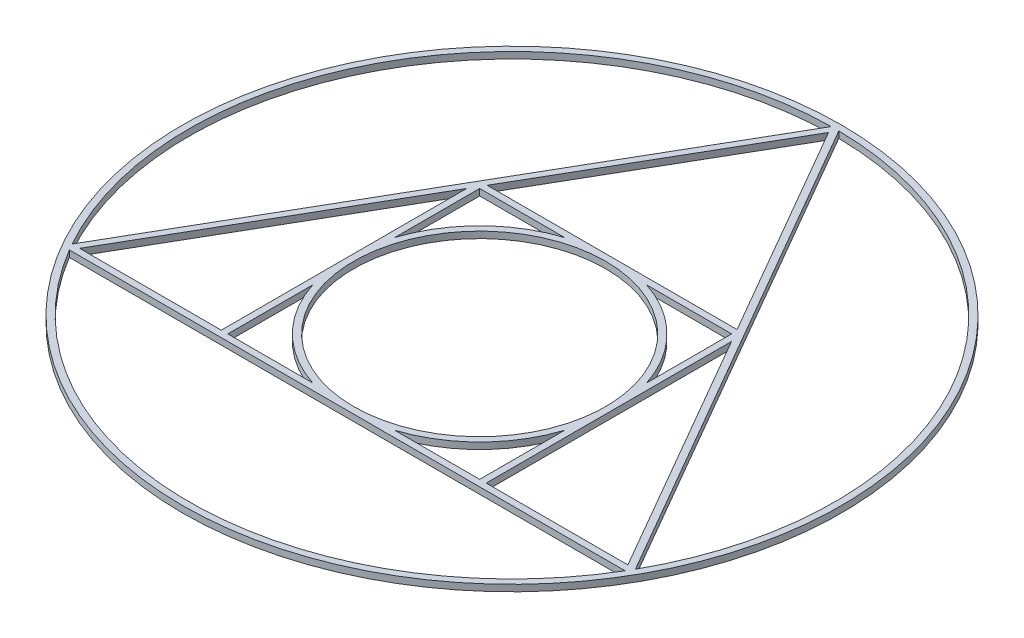
ISO-10303-21;
HEADER;
FILE_DESCRIPTION(('STEP AP214'),'2;1');
FILE_NAME('part.step','',(''),(''),'','','');
FILE_SCHEMA(('AUTOMOTIVE_DESIGN { 1 0 10303 214 1 1 1 1 }'));
ENDSEC;
DATA;
#1=APPLICATION_CONTEXT('core data for automotive mechanical design processes');
#2=APPLICATION_PROTOCOL_DEFINITION('international standard','automotive_design',2000,#1);
#3=PRODUCT_CONTEXT('',#1,'mechanical');
#4=PRODUCT('Part','Part','',(#3));
#5=PRODUCT_RELATED_PRODUCT_CATEGORY('part','',(#4));
#6=PRODUCT_DEFINITION_FORMATION('','',#4);
#7=PRODUCT_DEFINITION_CONTEXT('part definition',#1,'design');
#8=PRODUCT_DEFINITION('design','',#6,#7);
#9=PRODUCT_DEFINITION_SHAPE('','',#8);
#10=(LENGTH_UNIT() NAMED_UNIT(*) SI_UNIT(.MILLI.,.METRE.));
#11=(NAMED_UNIT(*) PLANE_ANGLE_UNIT() SI_UNIT($,.RADIAN.));
#12=(NAMED_UNIT(*) SI_UNIT($,.STERADIAN.) SOLID_ANGLE_UNIT());
#13=UNCERTAINTY_MEASURE_WITH_UNIT(LENGTH_MEASURE(1.E-05),#10,'distance_accuracy_value','');
#14=(GEOMETRIC_REPRESENTATION_CONTEXT(3) GLOBAL_UNCERTAINTY_ASSIGNED_CONTEXT((#13)) GLOBAL_UNIT_ASSIGNED_CONTEXT((#10,
#11,#12)) REPRESENTATION_CONTEXT('',''));
#15=CARTESIAN_POINT('',(0.,0.,0.));
#16=DIRECTION('',(0.,0.,1.));
#17=DIRECTION('',(1.,0.,0.));
#18=AXIS2_PLACEMENT_3D('',#15,#16,#17);
#19=CARTESIAN_POINT('',(-69.8234858046924,3.61,0.));
#20=DIRECTION('',(-1.,0.,0.));
#21=DIRECTION('',(0.,0.,1.));
#22=AXIS2_PLACEMENT_3D('',#19,#20,#21);
#23=PLANE('',#22);
#24=DIRECTION('',(0.,0.,-1.));
#25=VECTOR('',#24,1.);
#26=CARTESIAN_POINT('',(-69.8234858046924,0.,0.));
#27=LINE('',#26,#25);
#28=CARTESIAN_POINT('',(-69.8234858046924,0.,87.7425));
#29=VERTEX_POINT('',#28);
#30=CARTESIAN_POINT('',(-69.8234858046924,0.,40.6601150373927));
#31=VERTEX_POINT('',#30);
#32=EDGE_CURVE('E239',#29,#31,#27,.T.);
#33=ORIENTED_EDGE('',*,*,#32,.T.);
#34=DIRECTION('',(0.,-1.,0.));
#35=VECTOR('',#34,1.);
#36=CARTESIAN_POINT('',(-69.8234858046924,3.61,40.6601150373927));
#37=LINE('',#36,#35);
#38=CARTESIAN_POINT('',(-69.8234858046924,3.61,40.6601150373927));
#39=VERTEX_POINT('',#38);
#40=EDGE_CURVE('E11',#39,#31,#37,.T.);
#41=ORIENTED_EDGE('',*,*,#40,.F.);
#42=DIRECTION('',(0.,0.,-1.));
#43=VECTOR('',#42,1.);
#44=CARTESIAN_POINT('',(-69.8234858046924,3.61,0.));
#45=LINE('',#44,#43);
#46=CARTESIAN_POINT('',(-69.8234858046924,3.61,87.7425));
#47=VERTEX_POINT('',#46);
#48=EDGE_CURVE('E233',#47,#39,#45,.T.);
#49=ORIENTED_EDGE('',*,*,#48,.F.);
#50=DIRECTION('',(0.,-1.,0.));
#51=VECTOR('',#50,1.);
#52=CARTESIAN_POINT('',(-69.8234858046924,3.61,87.7425));
#53=LINE('',#52,#51);
#54=EDGE_CURVE('E59',#47,#29,#53,.T.);
#55=ORIENTED_EDGE('',*,*,#54,.T.);
#56=EDGE_LOOP('',(#33,#41,#49,#55));
#57=FACE_BOUND('',#56,.T.);
#58=ADVANCED_FACE('F39',(#57),#23,.F.);
#59=CARTESIAN_POINT('',(0.,3.61,17.9190141953076));
#60=DIRECTION('',(0.,-1.,0.));
#61=DIRECTION('',(0.,0.,-1.));
#62=AXIS2_PLACEMENT_3D('',#59,#60,#61);
#63=CYLINDRICAL_SURFACE('',#62,73.4334858046924);
#64=CARTESIAN_POINT('',(0.,0.,17.9190141953076));
#65=DIRECTION('',(0.,1.,0.));
#66=DIRECTION('',(0.,0.,1.));
#67=AXIS2_PLACEMENT_3D('',#64,#65,#66);
#68=CIRCLE('',#67,73.4334858046924);
#69=CARTESIAN_POINT('',(-22.7411008420851,0.,87.7425));
#70=VERTEX_POINT('',#69);
#71=EDGE_CURVE('E243',#31,#70,#68,.T.);
#72=ORIENTED_EDGE('',*,*,#71,.T.);
#73=DIRECTION('',(0.,-1.,0.));
#74=VECTOR('',#73,1.);
#75=CARTESIAN_POINT('',(-22.7411008420851,3.61,87.7425));
#76=LINE('',#75,#74);
#77=CARTESIAN_POINT('',(-22.7411008420851,3.61,87.7425));
#78=VERTEX_POINT('',#77);
#79=EDGE_CURVE('E50',#78,#70,#76,.T.);
#80=ORIENTED_EDGE('',*,*,#79,.F.);
#81=CARTESIAN_POINT('',(0.,3.61,17.9190141953076));
#82=DIRECTION('',(0.,1.,0.));
#83=DIRECTION('',(0.,0.,1.));
#84=AXIS2_PLACEMENT_3D('',#81,#82,#83);
#85=CIRCLE('',#84,73.4334858046924);
#86=EDGE_CURVE('E225',#39,#78,#85,.T.);
#87=ORIENTED_EDGE('',*,*,#86,.F.);
#88=ORIENTED_EDGE('',*,*,#40,.T.);
#89=EDGE_LOOP('',(#72,#80,#87,#88));
#90=FACE_BOUND('',#89,.T.);
#91=ADVANCED_FACE('F227',(#90),#63,.T.);
#92=CARTESIAN_POINT('',(0.,3.61,-51.9044716093848));
#93=DIRECTION('',(0.,0.,1.));
#94=DIRECTION('',(1.,0.,0.));
#95=AXIS2_PLACEMENT_3D('',#92,#93,#94);
#96=PLANE('',#95);
#97=DIRECTION('',(-1.,0.,0.));
#98=VECTOR('',#97,1.);
#99=CARTESIAN_POINT('',(0.,0.,-51.9044716093848));
#100=LINE('',#99,#98);
#101=CARTESIAN_POINT('',(-22.7411008420851,0.,-51.9044716093848));
#102=VERTEX_POINT('',#101);
#103=CARTESIAN_POINT('',(-69.8234858046924,0.,-51.9044716093848));
#104=VERTEX_POINT('',#103);
#105=EDGE_CURVE('E428',#102,#104,#100,.T.);
#106=ORIENTED_EDGE('',*,*,#105,.F.);
#107=DIRECTION('',(0.,-1.,0.));
#108=VECTOR('',#107,1.);
#109=CARTESIAN_POINT('',(-22.7411008420851,3.61,-51.9044716093848));
#110=LINE('',#109,#108);
#111=CARTESIAN_POINT('',(-22.7411008420851,3.61,-51.9044716093848));
#112=VERTEX_POINT('',#111);
#113=EDGE_CURVE('E260',#112,#102,#110,.T.);
#114=ORIENTED_EDGE('',*,*,#113,.F.);
#115=DIRECTION('',(-1.,0.,0.));
#116=VECTOR('',#115,1.);
#117=CARTESIAN_POINT('',(0.,3.61,-51.9044716093848));
#118=LINE('',#117,#116);
#119=CARTESIAN_POINT('',(-69.8234858046924,3.61,-51.9044716093848));
#120=VERTEX_POINT('',#119);
#121=EDGE_CURVE('E446',#112,#120,#118,.T.);
#122=ORIENTED_EDGE('',*,*,#121,.T.);
#123=DIRECTION('',(0.,-1.,0.));
#124=VECTOR('',#123,1.);
#125=CARTESIAN_POINT('',(-69.8234858046924,3.61,-51.9044716093848));
#126=LINE('',#125,#124);
#127=EDGE_CURVE('E263',#120,#104,#126,.T.);
#128=ORIENTED_EDGE('',*,*,#127,.T.);
#129=EDGE_LOOP('',(#106,#114,#122,#128));
#130=FACE_BOUND('',#129,.T.);
#131=ADVANCED_FACE('F442',(#130),#96,.T.);
#132=CARTESIAN_POINT('',(0.,3.61,17.9190141953076));
#133=DIRECTION('',(0.,-1.,0.));
#134=DIRECTION('',(0.,0.,-1.));
#135=AXIS2_PLACEMENT_3D('',#132,#133,#134);
#136=CYLINDRICAL_SURFACE('',#135,73.4334858046924);
#137=CARTESIAN_POINT('',(0.,0.,17.9190141953076));
#138=DIRECTION('',(0.,1.,0.));
#139=DIRECTION('',(0.,0.,1.));
#140=AXIS2_PLACEMENT_3D('',#137,#138,#139);
#141=CIRCLE('',#140,73.4334858046924);
#142=CARTESIAN_POINT('',(-69.8234858046924,0.,-4.82208664677747));
#143=VERTEX_POINT('',#142);
#144=EDGE_CURVE('E251',#102,#143,#141,.T.);
#145=ORIENTED_EDGE('',*,*,#144,.T.);
#146=DIRECTION('',(0.,-1.,0.));
#147=VECTOR('',#146,1.);
#148=CARTESIAN_POINT('',(-69.8234858046924,3.61,-4.82208664677747));
#149=LINE('',#148,#147);
#150=CARTESIAN_POINT('',(-69.8234858046924,3.61,-4.82208664677747));
#151=VERTEX_POINT('',#150);
#152=EDGE_CURVE('E266',#151,#143,#149,.T.);
#153=ORIENTED_EDGE('',*,*,#152,.F.);
#154=CARTESIAN_POINT('',(0.,3.61,17.9190141953076));
#155=DIRECTION('',(0.,1.,0.));
#156=DIRECTION('',(0.,0.,1.));
#157=AXIS2_PLACEMENT_3D('',#154,#155,#156);
#158=CIRCLE('',#157,73.4334858046924);
#159=EDGE_CURVE('E452',#112,#151,#158,.T.);
#160=ORIENTED_EDGE('',*,*,#159,.F.);
#161=ORIENTED_EDGE('',*,*,#113,.T.);
#162=EDGE_LOOP('',(#145,#153,#160,#161));
#163=FACE_BOUND('',#162,.T.);
#164=ADVANCED_FACE('F436',(#163),#136,.T.);
#165=CARTESIAN_POINT('',(69.8234858046924,3.61,0.));
#166=DIRECTION('',(-1.,0.,0.));
#167=DIRECTION('',(0.,0.,1.));
#168=AXIS2_PLACEMENT_3D('',#165,#166,#167);
#169=PLANE('',#168);
#170=DIRECTION('',(0.,0.,-1.));
#171=VECTOR('',#170,1.);
#172=CARTESIAN_POINT('',(69.8234858046924,0.,0.));
#173=LINE('',#172,#171);
#174=CARTESIAN_POINT('',(69.8234858046924,0.,-4.82208664677747));
#175=VERTEX_POINT('',#174);
#176=CARTESIAN_POINT('',(69.8234858046924,0.,-51.9044716093848));
#177=VERTEX_POINT('',#176);
#178=EDGE_CURVE('E416',#175,#177,#173,.T.);
#179=ORIENTED_EDGE('',*,*,#178,.F.);
#180=DIRECTION('',(0.,-1.,0.));
#181=VECTOR('',#180,1.);
#182=CARTESIAN_POINT('',(69.8234858046924,3.61,-4.82208664677747));
#183=LINE('',#182,#181);
#184=CARTESIAN_POINT('',(69.8234858046924,3.61,-4.82208664677747));
#185=VERTEX_POINT('',#184);
#186=EDGE_CURVE('E267',#185,#175,#183,.T.);
#187=ORIENTED_EDGE('',*,*,#186,.F.);
#188=DIRECTION('',(0.,0.,-1.));
#189=VECTOR('',#188,1.);
#190=CARTESIAN_POINT('',(69.8234858046924,3.61,0.));
#191=LINE('',#190,#189);
#192=CARTESIAN_POINT('',(69.8234858046924,3.61,-51.9044716093848));
#193=VERTEX_POINT('',#192);
#194=EDGE_CURVE('E466',#185,#193,#191,.T.);
#195=ORIENTED_EDGE('',*,*,#194,.T.);
#196=DIRECTION('',(0.,-1.,0.));
#197=VECTOR('',#196,1.);
#198=CARTESIAN_POINT('',(69.8234858046924,3.61,-51.9044716093848));
#199=LINE('',#198,#197);
#200=EDGE_CURVE('E273',#193,#177,#199,.T.);
#201=ORIENTED_EDGE('',*,*,#200,.T.);
#202=EDGE_LOOP('',(#179,#187,#195,#201));
#203=FACE_BOUND('',#202,.T.);
#204=ADVANCED_FACE('F587',(#203),#169,.T.);
#205=CARTESIAN_POINT('',(0.,3.61,17.9190141953076));
#206=DIRECTION('',(0.,-1.,0.));
#207=DIRECTION('',(0.,0.,-1.));
#208=AXIS2_PLACEMENT_3D('',#205,#206,#207);
#209=CYLINDRICAL_SURFACE('',#208,73.4334858046924);
#210=CARTESIAN_POINT('',(0.,0.,17.9190141953076));
#211=DIRECTION('',(0.,1.,0.));
#212=DIRECTION('',(0.,0.,1.));
#213=AXIS2_PLACEMENT_3D('',#210,#211,#212);
#214=CIRCLE('',#213,73.4334858046924);
#215=CARTESIAN_POINT('',(22.7411008420851,0.,-51.9044716093848));
#216=VERTEX_POINT('',#215);
#217=EDGE_CURVE('E420',#175,#216,#214,.T.);
#218=ORIENTED_EDGE('',*,*,#217,.T.);
#219=DIRECTION('',(0.,-1.,0.));
#220=VECTOR('',#219,1.);
#221=CARTESIAN_POINT('',(22.7411008420851,3.61,-51.9044716093848));
#222=LINE('',#221,#220);
#223=CARTESIAN_POINT('',(22.7411008420851,3.61,-51.9044716093848));
#224=VERTEX_POINT('',#223);
#225=EDGE_CURVE('E276',#224,#216,#222,.T.);
#226=ORIENTED_EDGE('',*,*,#225,.F.);
#227=CARTESIAN_POINT('',(0.,3.61,17.9190141953076));
#228=DIRECTION('',(0.,1.,0.));
#229=DIRECTION('',(0.,0.,1.));
#230=AXIS2_PLACEMENT_3D('',#227,#228,#229);
#231=CIRCLE('',#230,73.4334858046924);
#232=EDGE_CURVE('E463',#185,#224,#231,.T.);
#233=ORIENTED_EDGE('',*,*,#232,.F.);
#234=ORIENTED_EDGE('',*,*,#186,.T.);
#235=EDGE_LOOP('',(#218,#226,#233,#234));
#236=FACE_BOUND('',#235,.T.);
#237=ADVANCED_FACE('F585',(#236),#209,.T.);
#238=CARTESIAN_POINT('',(0.,3.61,87.7425));
#239=DIRECTION('',(0.,0.,1.));
#240=DIRECTION('',(1.,0.,0.));
#241=AXIS2_PLACEMENT_3D('',#238,#239,#240);
#242=PLANE('',#241);
#243=DIRECTION('',(-1.,0.,0.));
#244=VECTOR('',#243,1.);
#245=CARTESIAN_POINT('',(0.,0.,87.7425));
#246=LINE('',#245,#244);
#247=CARTESIAN_POINT('',(69.8234858046924,0.,87.7425));
#248=VERTEX_POINT('',#247);
#249=CARTESIAN_POINT('',(22.7411008420852,0.,87.7425));
#250=VERTEX_POINT('',#249);
#251=EDGE_CURVE('E404',#248,#250,#246,.T.);
#252=ORIENTED_EDGE('',*,*,#251,.T.);
#253=DIRECTION('',(0.,-1.,0.));
#254=VECTOR('',#253,1.);
#255=CARTESIAN_POINT('',(22.7411008420852,3.61,87.7425));
#256=LINE('',#255,#254);
#257=CARTESIAN_POINT('',(22.7411008420852,3.61,87.7425));
#258=VERTEX_POINT('',#257);
#259=EDGE_CURVE('E277',#258,#250,#256,.T.);
#260=ORIENTED_EDGE('',*,*,#259,.F.);
#261=DIRECTION('',(-1.,0.,0.));
#262=VECTOR('',#261,1.);
#263=CARTESIAN_POINT('',(0.,3.61,87.7425));
#264=LINE('',#263,#262);
#265=CARTESIAN_POINT('',(69.8234858046924,3.61,87.7425));
#266=VERTEX_POINT('',#265);
#267=EDGE_CURVE('E477',#266,#258,#264,.T.);
#268=ORIENTED_EDGE('',*,*,#267,.F.);
#269=DIRECTION('',(0.,-1.,0.));
#270=VECTOR('',#269,1.);
#271=CARTESIAN_POINT('',(69.8234858046924,3.61,87.7425));
#272=LINE('',#271,#270);
#273=EDGE_CURVE('E282',#266,#248,#272,.T.);
#274=ORIENTED_EDGE('',*,*,#273,.T.);
#275=EDGE_LOOP('',(#252,#260,#268,#274));
#276=FACE_BOUND('',#275,.T.);
#277=ADVANCED_FACE('F614',(#276),#242,.F.);
#278=CARTESIAN_POINT('',(0.,3.61,17.9190141953076));
#279=DIRECTION('',(0.,-1.,0.));
#280=DIRECTION('',(0.,0.,-1.));
#281=AXIS2_PLACEMENT_3D('',#278,#279,#280);
#282=CYLINDRICAL_SURFACE('',#281,73.4334858046924);
#283=CARTESIAN_POINT('',(0.,0.,17.9190141953076));
#284=DIRECTION('',(0.,1.,0.));
#285=DIRECTION('',(0.,0.,1.));
#286=AXIS2_PLACEMENT_3D('',#283,#284,#285);
#287=CIRCLE('',#286,73.4334858046924);
#288=CARTESIAN_POINT('',(69.8234858046924,0.,40.6601150373927));
#289=VERTEX_POINT('',#288);
#290=EDGE_CURVE('E408',#250,#289,#287,.T.);
#291=ORIENTED_EDGE('',*,*,#290,.T.);
#292=DIRECTION('',(0.,-1.,0.));
#293=VECTOR('',#292,1.);
#294=CARTESIAN_POINT('',(69.8234858046924,3.61,40.6601150373927));
#295=LINE('',#294,#293);
#296=CARTESIAN_POINT('',(69.8234858046924,3.61,40.6601150373927));
#297=VERTEX_POINT('',#296);
#298=EDGE_CURVE('E285',#297,#289,#295,.T.);
#299=ORIENTED_EDGE('',*,*,#298,.F.);
#300=CARTESIAN_POINT('',(0.,3.61,17.9190141953076));
#301=DIRECTION('',(0.,1.,0.));
#302=DIRECTION('',(0.,0.,1.));
#303=AXIS2_PLACEMENT_3D('',#300,#301,#302);
#304=CIRCLE('',#303,73.4334858046924);
#305=EDGE_CURVE('E474',#258,#297,#304,.T.);
#306=ORIENTED_EDGE('',*,*,#305,.F.);
#307=ORIENTED_EDGE('',*,*,#259,.T.);
#308=EDGE_LOOP('',(#291,#299,#306,#307));
#309=FACE_BOUND('',#308,.T.);
#310=ADVANCED_FACE('F621',(#309),#282,.T.);
#311=CARTESIAN_POINT('',(0.,3.61,0.));
#312=DIRECTION('',(0.,-1.,0.));
#313=DIRECTION('',(0.,0.,-1.));
#314=AXIS2_PLACEMENT_3D('',#311,#312,#313);
#315=CYLINDRICAL_SURFACE('',#314,179.095);
#316=CARTESIAN_POINT('',(0.,0.,0.));
#317=DIRECTION('',(0.,1.,0.));
#318=DIRECTION('',(0.,0.,1.));
#319=AXIS2_PLACEMENT_3D('',#316,#317,#318);
#320=CIRCLE('',#319,179.095);
#321=CARTESIAN_POINT('',(-2.09128410943485,0.,-179.082789669397));
#322=VERTEX_POINT('',#321);
#323=CARTESIAN_POINT('',(-156.135887289001,0.,87.7302896693974));
#324=VERTEX_POINT('',#323);
#325=EDGE_CURVE('E392',#322,#324,#320,.T.);
#326=ORIENTED_EDGE('',*,*,#325,.F.);
#327=DIRECTION('',(0.,-1.,0.));
#328=VECTOR('',#327,1.);
#329=CARTESIAN_POINT('',(-2.09128410943485,3.61,-179.082789669397));
#330=LINE('',#329,#328);
#331=CARTESIAN_POINT('',(-2.09128410943485,3.61,-179.082789669397));
#332=VERTEX_POINT('',#331);
#333=EDGE_CURVE('E286',#332,#322,#330,.T.);
#334=ORIENTED_EDGE('',*,*,#333,.F.);
#335=CARTESIAN_POINT('',(0.,3.61,0.));
#336=DIRECTION('',(0.,1.,0.));
#337=DIRECTION('',(0.,0.,1.));
#338=AXIS2_PLACEMENT_3D('',#335,#336,#337);
#339=CIRCLE('',#338,179.095);
#340=CARTESIAN_POINT('',(-156.135887289001,3.61,87.7302896693974));
#341=VERTEX_POINT('',#340);
#342=EDGE_CURVE('E488',#332,#341,#339,.T.);
#343=ORIENTED_EDGE('',*,*,#342,.T.);
#344=DIRECTION('',(0.,-1.,0.));
#345=VECTOR('',#344,1.);
#346=CARTESIAN_POINT('',(-156.135887289001,3.61,87.7302896693974));
#347=LINE('',#346,#345);
#348=EDGE_CURVE('E292',#341,#324,#347,.T.);
#349=ORIENTED_EDGE('',*,*,#348,.T.);
#350=EDGE_LOOP('',(#326,#334,#343,#349));
#351=FACE_BOUND('',#350,.T.);
#352=ADVANCED_FACE('F624',(#351),#315,.F.);
#353=CARTESIAN_POINT('',(-75.9872339915561,3.61,-43.87125));
#354=DIRECTION('',(0.866025403784439,0.,0.5));
#355=DIRECTION('',(0.5,0.,-0.866025403784439));
#356=AXIS2_PLACEMENT_3D('',#353,#354,#355);
#357=PLANE('',#356);
#358=DIRECTION('',(-0.5,0.,0.866025403784439));
#359=VECTOR('',#358,1.);
#360=CARTESIAN_POINT('',(-75.9872339915561,0.,-43.87125));
#361=LINE('',#360,#359);
#362=CARTESIAN_POINT('',(-73.4334858046924,0.,-48.2944716093847));
#363=VERTEX_POINT('',#362);
#364=CARTESIAN_POINT('',(-151.974467983112,0.,87.7425000000001));
#365=VERTEX_POINT('',#364);
#366=EDGE_CURVE('E380',#363,#365,#361,.T.);
#367=ORIENTED_EDGE('',*,*,#366,.F.);
#368=DIRECTION('',(0.,-1.,0.));
#369=VECTOR('',#368,1.);
#370=CARTESIAN_POINT('',(-73.4334858046924,3.61,-48.2944716093847));
#371=LINE('',#370,#369);
#372=CARTESIAN_POINT('',(-73.4334858046924,3.61,-48.2944716093847));
#373=VERTEX_POINT('',#372);
#374=EDGE_CURVE('E295',#373,#363,#371,.T.);
#375=ORIENTED_EDGE('',*,*,#374,.F.);
#376=DIRECTION('',(-0.5,0.,0.866025403784439));
#377=VECTOR('',#376,1.);
#378=CARTESIAN_POINT('',(-75.9872339915561,3.61,-43.87125));
#379=LINE('',#378,#377);
#380=CARTESIAN_POINT('',(-151.974467983112,3.61,87.7425000000001));
#381=VERTEX_POINT('',#380);
#382=EDGE_CURVE('E500',#373,#381,#379,.T.);
#383=ORIENTED_EDGE('',*,*,#382,.T.);
#384=DIRECTION('',(0.,-1.,0.));
#385=VECTOR('',#384,1.);
#386=CARTESIAN_POINT('',(-151.974467983112,3.61,87.7425000000001));
#387=LINE('',#386,#385);
#388=EDGE_CURVE('E298',#381,#365,#387,.T.);
#389=ORIENTED_EDGE('',*,*,#388,.T.);
#390=EDGE_LOOP('',(#367,#375,#383,#389));
#391=FACE_BOUND('',#390,.T.);
#392=ADVANCED_FACE('F639',(#391),#357,.T.);
#393=CARTESIAN_POINT('',(-73.4334858046924,3.61,0.));
#394=DIRECTION('',(-1.,0.,0.));
#395=DIRECTION('',(0.,0.,1.));
#396=AXIS2_PLACEMENT_3D('',#393,#394,#395);
#397=PLANE('',#396);
#398=DIRECTION('',(0.,0.,-1.));
#399=VECTOR('',#398,1.);
#400=CARTESIAN_POINT('',(-73.4334858046924,0.,0.));
#401=LINE('',#400,#399);
#402=CARTESIAN_POINT('',(-73.4334858046924,0.,87.7425));
#403=VERTEX_POINT('',#402);
#404=EDGE_CURVE('E384',#403,#363,#401,.T.);
#405=ORIENTED_EDGE('',*,*,#404,.F.);
#406=DIRECTION('',(0.,-1.,0.));
#407=VECTOR('',#406,1.);
#408=CARTESIAN_POINT('',(-73.4334858046924,3.61,87.7425));
#409=LINE('',#408,#407);
#410=CARTESIAN_POINT('',(-73.4334858046924,3.61,87.7425));
#411=VERTEX_POINT('',#410);
#412=EDGE_CURVE('E301',#411,#403,#409,.T.);
#413=ORIENTED_EDGE('',*,*,#412,.F.);
#414=DIRECTION('',(0.,0.,-1.));
#415=VECTOR('',#414,1.);
#416=CARTESIAN_POINT('',(-73.4334858046924,3.61,0.));
#417=LINE('',#416,#415);
#418=EDGE_CURVE('E496',#411,#373,#417,.T.);
#419=ORIENTED_EDGE('',*,*,#418,.T.);
#420=ORIENTED_EDGE('',*,*,#374,.T.);
#421=EDGE_LOOP('',(#405,#413,#419,#420));
#422=FACE_BOUND('',#421,.T.);
#423=ADVANCED_FACE('F645',(#422),#397,.T.);
#424=CARTESIAN_POINT('',(0.,3.61,87.7425));
#425=DIRECTION('',(0.,0.,-1.));
#426=DIRECTION('',(-1.,0.,0.));
#427=AXIS2_PLACEMENT_3D('',#424,#425,#426);
#428=PLANE('',#427);
#429=DIRECTION('',(1.,0.,0.));
#430=VECTOR('',#429,1.);
#431=CARTESIAN_POINT('',(0.,0.,87.7425));
#432=LINE('',#431,#430);
#433=CARTESIAN_POINT('',(73.4334858046924,0.,87.7425));
#434=VERTEX_POINT('',#433);
#435=CARTESIAN_POINT('',(151.974467983112,0.,87.7424999999999));
#436=VERTEX_POINT('',#435);
#437=EDGE_CURVE('E368',#434,#436,#432,.T.);
#438=ORIENTED_EDGE('',*,*,#437,.F.);
#439=DIRECTION('',(0.,-1.,0.));
#440=VECTOR('',#439,1.);
#441=CARTESIAN_POINT('',(73.4334858046924,3.61,87.7425));
#442=LINE('',#441,#440);
#443=CARTESIAN_POINT('',(73.4334858046924,3.61,87.7425));
#444=VERTEX_POINT('',#443);
#445=EDGE_CURVE('E302',#444,#434,#442,.T.);
#446=ORIENTED_EDGE('',*,*,#445,.F.);
#447=DIRECTION('',(1.,0.,0.));
#448=VECTOR('',#447,1.);
#449=CARTESIAN_POINT('',(0.,3.61,87.7425));
#450=LINE('',#449,#448);
#451=CARTESIAN_POINT('',(151.974467983112,3.61,87.7424999999999));
#452=VERTEX_POINT('',#451);
#453=EDGE_CURVE('E511',#444,#452,#450,.T.);
#454=ORIENTED_EDGE('',*,*,#453,.T.);
#455=DIRECTION('',(0.,-1.,0.));
#456=VECTOR('',#455,1.);
#457=CARTESIAN_POINT('',(151.974467983112,3.61,87.7424999999999));
#458=LINE('',#457,#456);
#459=EDGE_CURVE('E307',#452,#436,#458,.T.);
#460=ORIENTED_EDGE('',*,*,#459,.T.);
#461=EDGE_LOOP('',(#438,#446,#454,#460));
#462=FACE_BOUND('',#461,.T.);
#463=ADVANCED_FACE('F648',(#462),#428,.T.);
#464=CARTESIAN_POINT('',(73.4334858046924,3.61,0.));
#465=DIRECTION('',(-1.,0.,0.));
#466=DIRECTION('',(0.,0.,1.));
#467=AXIS2_PLACEMENT_3D('',#464,#465,#466);
#468=PLANE('',#467);
#469=DIRECTION('',(0.,0.,-1.));
#470=VECTOR('',#469,1.);
#471=CARTESIAN_POINT('',(73.4334858046924,0.,0.));
#472=LINE('',#471,#470);
#473=CARTESIAN_POINT('',(73.4334858046924,0.,-48.2944716093849));
#474=VERTEX_POINT('',#473);
#475=EDGE_CURVE('E372',#434,#474,#472,.T.);
#476=ORIENTED_EDGE('',*,*,#475,.T.);
#477=DIRECTION('',(0.,-1.,0.));
#478=VECTOR('',#477,1.);
#479=CARTESIAN_POINT('',(73.4334858046924,3.61,-48.2944716093849));
#480=LINE('',#479,#478);
#481=CARTESIAN_POINT('',(73.4334858046924,3.61,-48.2944716093849));
#482=VERTEX_POINT('',#481);
#483=EDGE_CURVE('E310',#482,#474,#480,.T.);
#484=ORIENTED_EDGE('',*,*,#483,.F.);
#485=DIRECTION('',(0.,0.,-1.));
#486=VECTOR('',#485,1.);
#487=CARTESIAN_POINT('',(73.4334858046924,3.61,0.));
#488=LINE('',#487,#486);
#489=EDGE_CURVE('E508',#444,#482,#488,.T.);
#490=ORIENTED_EDGE('',*,*,#489,.F.);
#491=ORIENTED_EDGE('',*,*,#445,.T.);
#492=EDGE_LOOP('',(#476,#484,#490,#491));
#493=FACE_BOUND('',#492,.T.);
#494=ADVANCED_FACE('F657',(#493),#468,.F.);
#495=CARTESIAN_POINT('',(75.9872339915561,3.61,-43.87125));
#496=DIRECTION('',(-0.866025403784439,0.,0.5));
#497=DIRECTION('',(0.5,0.,0.866025403784439));
#498=AXIS2_PLACEMENT_3D('',#495,#496,#497);
#499=PLANE('',#498);
#500=DIRECTION('',(-0.5,0.,-0.866025403784439));
#501=VECTOR('',#500,1.);
#502=CARTESIAN_POINT('',(75.9872339915561,0.,-43.87125));
#503=LINE('',#502,#501);
#504=CARTESIAN_POINT('',(69.2650168611382,0.,-55.5144716093937));
#505=VERTEX_POINT('',#504);
#506=CARTESIAN_POINT('',(0.,0.,-175.485));
#507=VERTEX_POINT('',#506);
#508=EDGE_CURVE('E356',#505,#507,#503,.T.);
#509=ORIENTED_EDGE('',*,*,#508,.F.);
#510=DIRECTION('',(0.,-1.,0.));
#511=VECTOR('',#510,1.);
#512=CARTESIAN_POINT('',(69.2650168611382,3.61,-55.5144716093937));
#513=LINE('',#512,#511);
#514=CARTESIAN_POINT('',(69.2650168611382,3.61,-55.5144716093937));
#515=VERTEX_POINT('',#514);
#516=EDGE_CURVE('E311',#515,#505,#513,.T.);
#517=ORIENTED_EDGE('',*,*,#516,.F.);
#518=DIRECTION('',(-0.5,0.,-0.866025403784439));
#519=VECTOR('',#518,1.);
#520=CARTESIAN_POINT('',(75.9872339915561,3.61,-43.87125));
#521=LINE('',#520,#519);
#522=CARTESIAN_POINT('',(0.,3.61,-175.485));
#523=VERTEX_POINT('',#522);
#524=EDGE_CURVE('E522',#515,#523,#521,.T.);
#525=ORIENTED_EDGE('',*,*,#524,.T.);
#526=DIRECTION('',(0.,-1.,0.));
#527=VECTOR('',#526,1.);
#528=CARTESIAN_POINT('',(0.,3.61,-175.485));
#529=LINE('',#528,#527);
#530=EDGE_CURVE('E316',#523,#507,#529,.T.);
#531=ORIENTED_EDGE('',*,*,#530,.T.);
#532=EDGE_LOOP('',(#509,#517,#525,#531));
#533=FACE_BOUND('',#532,.T.);
#534=ADVANCED_FACE('F660',(#533),#499,.T.);
#535=CARTESIAN_POINT('',(-3.48698479976692E-12,3.61,-55.5144716093894));
#536=DIRECTION('',(0.,0.,1.));
#537=DIRECTION('',(1.,0.,0.));
#538=AXIS2_PLACEMENT_3D('',#535,#536,#537);
#539=PLANE('',#538);
#540=DIRECTION('',(-1.,0.,0.));
#541=VECTOR('',#540,1.);
#542=CARTESIAN_POINT('',(-3.48698479976692E-12,0.,-55.5144716093894));
#543=LINE('',#542,#541);
#544=CARTESIAN_POINT('',(-69.2650168611432,0.,-55.514471609385));
#545=VERTEX_POINT('',#544);
#546=EDGE_CURVE('E360',#505,#545,#543,.T.);
#547=ORIENTED_EDGE('',*,*,#546,.T.);
#548=DIRECTION('',(0.,-1.,0.));
#549=VECTOR('',#548,1.);
#550=CARTESIAN_POINT('',(-69.2650168611432,3.61,-55.514471609385));
#551=LINE('',#550,#549);
#552=CARTESIAN_POINT('',(-69.2650168611432,3.61,-55.514471609385));
#553=VERTEX_POINT('',#552);
#554=EDGE_CURVE('E319',#553,#545,#551,.T.);
#555=ORIENTED_EDGE('',*,*,#554,.F.);
#556=DIRECTION('',(-1.,0.,0.));
#557=VECTOR('',#556,1.);
#558=CARTESIAN_POINT('',(-3.48698479976692E-12,3.61,-55.5144716093894));
#559=LINE('',#558,#557);
#560=EDGE_CURVE('E519',#515,#553,#559,.T.);
#561=ORIENTED_EDGE('',*,*,#560,.F.);
#562=ORIENTED_EDGE('',*,*,#516,.T.);
#563=EDGE_LOOP('',(#547,#555,#561,#562));
#564=FACE_BOUND('',#563,.T.);
#565=ADVANCED_FACE('F669',(#564),#539,.F.);
#566=CARTESIAN_POINT('',(0.,3.61,0.));
#567=DIRECTION('',(0.,-1.,0.));
#568=DIRECTION('',(0.,0.,-1.));
#569=AXIS2_PLACEMENT_3D('',#566,#567,#568);
#570=CYLINDRICAL_SURFACE('',#569,179.095);
#571=CARTESIAN_POINT('',(0.,0.,0.));
#572=DIRECTION('',(0.,1.,0.));
#573=DIRECTION('',(0.,0.,1.));
#574=AXIS2_PLACEMENT_3D('',#571,#572,#573);
#575=CIRCLE('',#574,179.095);
#576=CARTESIAN_POINT('',(-154.044603179566,0.,91.3525000000001));
#577=VERTEX_POINT('',#576);
#578=CARTESIAN_POINT('',(154.044603179566,0.,91.3525));
#579=VERTEX_POINT('',#578);
#580=EDGE_CURVE('E344',#577,#579,#575,.T.);
#581=ORIENTED_EDGE('',*,*,#580,.F.);
#582=DIRECTION('',(0.,-1.,0.));
#583=VECTOR('',#582,1.);
#584=CARTESIAN_POINT('',(-154.044603179566,3.61,91.3525000000001));
#585=LINE('',#584,#583);
#586=CARTESIAN_POINT('',(-154.044603179566,3.61,91.3525000000001));
#587=VERTEX_POINT('',#586);
#588=EDGE_CURVE('E320',#587,#577,#585,.T.);
#589=ORIENTED_EDGE('',*,*,#588,.F.);
#590=CARTESIAN_POINT('',(0.,3.61,0.));
#591=DIRECTION('',(0.,1.,0.));
#592=DIRECTION('',(0.,0.,1.));
#593=AXIS2_PLACEMENT_3D('',#590,#591,#592);
#594=CIRCLE('',#593,179.095);
#595=CARTESIAN_POINT('',(154.044603179566,3.61,91.3525));
#596=VERTEX_POINT('',#595);
#597=EDGE_CURVE('E533',#587,#596,#594,.T.);
#598=ORIENTED_EDGE('',*,*,#597,.T.);
#599=DIRECTION('',(0.,-1.,0.));
#600=VECTOR('',#599,1.);
#601=CARTESIAN_POINT('',(154.044603179566,3.61,91.3525));
#602=LINE('',#601,#600);
#603=EDGE_CURVE('E325',#596,#579,#602,.T.);
#604=ORIENTED_EDGE('',*,*,#603,.T.);
#605=EDGE_LOOP('',(#581,#589,#598,#604));
#606=FACE_BOUND('',#605,.T.);
#607=ADVANCED_FACE('F672',(#606),#570,.F.);
#608=CARTESIAN_POINT('',(0.,3.61,0.));
#609=DIRECTION('',(0.,-1.,0.));
#610=DIRECTION('',(0.,0.,-1.));
#611=AXIS2_PLACEMENT_3D('',#608,#609,#610);
#612=CYLINDRICAL_SURFACE('',#611,179.095);
#613=CARTESIAN_POINT('',(0.,0.,0.));
#614=DIRECTION('',(0.,1.,0.));
#615=DIRECTION('',(0.,0.,1.));
#616=AXIS2_PLACEMENT_3D('',#613,#614,#615);
#617=CIRCLE('',#616,179.095);
#618=CARTESIAN_POINT('',(156.135887289001,0.,87.7302896693973));
#619=VERTEX_POINT('',#618);
#620=CARTESIAN_POINT('',(2.09128410943493,0.,-179.082789669397));
#621=VERTEX_POINT('',#620);
#622=EDGE_CURVE('E337',#619,#621,#617,.T.);
#623=ORIENTED_EDGE('',*,*,#622,.F.);
#624=DIRECTION('',(0.,-1.,0.));
#625=VECTOR('',#624,1.);
#626=CARTESIAN_POINT('',(156.135887289001,3.61,87.7302896693973));
#627=LINE('',#626,#625);
#628=CARTESIAN_POINT('',(156.135887289001,3.61,87.7302896693973));
#629=VERTEX_POINT('',#628);
#630=EDGE_CURVE('E43',#629,#619,#627,.T.);
#631=ORIENTED_EDGE('',*,*,#630,.F.);
#632=CARTESIAN_POINT('',(0.,3.61,0.));
#633=DIRECTION('',(0.,1.,0.));
#634=DIRECTION('',(0.,0.,1.));
#635=AXIS2_PLACEMENT_3D('',#632,#633,#634);
#636=CIRCLE('',#635,179.095);
#637=CARTESIAN_POINT('',(2.09128410943493,3.61,-179.082789669397));
#638=VERTEX_POINT('',#637);
#639=EDGE_CURVE('E257',#629,#638,#636,.T.);
#640=ORIENTED_EDGE('',*,*,#639,.T.);
#641=DIRECTION('',(0.,-1.,0.));
#642=VECTOR('',#641,1.);
#643=CARTESIAN_POINT('',(2.09128410943493,3.61,-179.082789669397));
#644=LINE('',#643,#642);
#645=EDGE_CURVE('E329',#638,#621,#644,.T.);
#646=ORIENTED_EDGE('',*,*,#645,.T.);
#647=EDGE_LOOP('',(#623,#631,#640,#646));
#648=FACE_BOUND('',#647,.T.);
#649=ADVANCED_FACE('F41',(#648),#612,.F.);
#650=CARTESIAN_POINT('',(-69.8234858046924,3.61,0.));
#651=DIRECTION('',(-1.,0.,0.));
#652=DIRECTION('',(0.,0.,1.));
#653=AXIS2_PLACEMENT_3D('',#650,#651,#652);
#654=PLANE('',#653);
#655=DIRECTION('',(0.,0.,-1.));
#656=VECTOR('',#655,1.);
#657=CARTESIAN_POINT('',(-69.8234858046924,0.,0.));
#658=LINE('',#657,#656);
#659=EDGE_CURVE('E244',#143,#104,#658,.T.);
#660=ORIENTED_EDGE('',*,*,#659,.T.);
#661=ORIENTED_EDGE('',*,*,#127,.F.);
#662=DIRECTION('',(0.,0.,-1.));
#663=VECTOR('',#662,1.);
#664=CARTESIAN_POINT('',(-69.8234858046924,3.61,0.));
#665=LINE('',#664,#663);
#666=EDGE_CURVE('E237',#151,#120,#665,.T.);
#667=ORIENTED_EDGE('',*,*,#666,.F.);
#668=ORIENTED_EDGE('',*,*,#152,.T.);
#669=EDGE_LOOP('',(#660,#661,#667,#668));
#670=FACE_BOUND('',#669,.T.);
#671=ADVANCED_FACE('F448',(#670),#654,.F.);
#672=CARTESIAN_POINT('',(0.,3.61,-51.9044716093848));
#673=DIRECTION('',(0.,0.,1.));
#674=DIRECTION('',(1.,0.,0.));
#675=AXIS2_PLACEMENT_3D('',#672,#673,#674);
#676=PLANE('',#675);
#677=DIRECTION('',(-1.,0.,0.));
#678=VECTOR('',#677,1.);
#679=CARTESIAN_POINT('',(0.,0.,-51.9044716093848));
#680=LINE('',#679,#678);
#681=EDGE_CURVE('E424',#177,#216,#680,.T.);
#682=ORIENTED_EDGE('',*,*,#681,.F.);
#683=ORIENTED_EDGE('',*,*,#200,.F.);
#684=DIRECTION('',(-1.,0.,0.));
#685=VECTOR('',#684,1.);
#686=CARTESIAN_POINT('',(0.,3.61,-51.9044716093848));
#687=LINE('',#686,#685);
#688=EDGE_CURVE('E457',#193,#224,#687,.T.);
#689=ORIENTED_EDGE('',*,*,#688,.T.);
#690=ORIENTED_EDGE('',*,*,#225,.T.);
#691=EDGE_LOOP('',(#682,#683,#689,#690));
#692=FACE_BOUND('',#691,.T.);
#693=ADVANCED_FACE('F580',(#692),#676,.T.);
#694=CARTESIAN_POINT('',(69.8234858046924,3.61,0.));
#695=DIRECTION('',(-1.,0.,0.));
#696=DIRECTION('',(0.,0.,1.));
#697=AXIS2_PLACEMENT_3D('',#694,#695,#696);
#698=PLANE('',#697);
#699=DIRECTION('',(0.,0.,-1.));
#700=VECTOR('',#699,1.);
#701=CARTESIAN_POINT('',(69.8234858046924,0.,0.));
#702=LINE('',#701,#700);
#703=EDGE_CURVE('E412',#248,#289,#702,.T.);
#704=ORIENTED_EDGE('',*,*,#703,.F.);
#705=ORIENTED_EDGE('',*,*,#273,.F.);
#706=DIRECTION('',(0.,0.,-1.));
#707=VECTOR('',#706,1.);
#708=CARTESIAN_POINT('',(69.8234858046924,3.61,0.));
#709=LINE('',#708,#707);
#710=EDGE_CURVE('E470',#266,#297,#709,.T.);
#711=ORIENTED_EDGE('',*,*,#710,.T.);
#712=ORIENTED_EDGE('',*,*,#298,.T.);
#713=EDGE_LOOP('',(#704,#705,#711,#712));
#714=FACE_BOUND('',#713,.T.);
#715=ADVANCED_FACE('F611',(#714),#698,.T.);
#716=CARTESIAN_POINT('',(0.,3.61,0.));
#717=DIRECTION('',(0.,-1.,0.));
#718=DIRECTION('',(0.,0.,-1.));
#719=AXIS2_PLACEMENT_3D('',#716,#717,#718);
#720=CYLINDRICAL_SURFACE('',#719,182.705);
#721=CARTESIAN_POINT('',(0.,3.61,0.));
#722=DIRECTION('',(0.,1.,0.));
#723=DIRECTION('',(0.,0.,1.));
#724=AXIS2_PLACEMENT_3D('',#721,#722,#723);
#725=CIRCLE('',#724,182.705);
#726=CARTESIAN_POINT('',(0.,3.61,182.705));
#727=VERTEX_POINT('',#726);
#728=EDGE_CURVE('E481',#727,#727,#725,.T.);
#729=ORIENTED_EDGE('',*,*,#728,.F.);
#730=EDGE_LOOP('',(#729));
#731=FACE_BOUND('',#730,.T.);
#732=CARTESIAN_POINT('',(0.,0.,0.));
#733=DIRECTION('',(0.,1.,0.));
#734=DIRECTION('',(0.,0.,1.));
#735=AXIS2_PLACEMENT_3D('',#732,#733,#734);
#736=CIRCLE('',#735,182.705);
#737=CARTESIAN_POINT('',(0.,0.,182.705));
#738=VERTEX_POINT('',#737);
#739=EDGE_CURVE('E400',#738,#738,#736,.T.);
#740=ORIENTED_EDGE('',*,*,#739,.T.);
#741=EDGE_LOOP('',(#740));
#742=FACE_BOUND('',#741,.T.);
#743=ADVANCED_FACE('F619',(#731,#742),#720,.T.);
#744=CARTESIAN_POINT('',(-79.1135856992179,3.61,-45.67625));
#745=DIRECTION('',(0.866025403784439,0.,0.5));
#746=DIRECTION('',(0.5,0.,-0.866025403784439));
#747=AXIS2_PLACEMENT_3D('',#744,#745,#746);
#748=PLANE('',#747);
#749=DIRECTION('',(-0.5,0.,0.866025403784439));
#750=VECTOR('',#749,1.);
#751=CARTESIAN_POINT('',(-79.1135856992179,0.,-45.67625));
#752=LINE('',#751,#750);
#753=EDGE_CURVE('E396',#322,#324,#752,.T.);
#754=ORIENTED_EDGE('',*,*,#753,.T.);
#755=ORIENTED_EDGE('',*,*,#348,.F.);
#756=DIRECTION('',(-0.5,0.,0.866025403784439));
#757=VECTOR('',#756,1.);
#758=CARTESIAN_POINT('',(-79.1135856992179,3.61,-45.67625));
#759=LINE('',#758,#757);
#760=EDGE_CURVE('E485',#332,#341,#759,.T.);
#761=ORIENTED_EDGE('',*,*,#760,.F.);
#762=ORIENTED_EDGE('',*,*,#333,.T.);
#763=EDGE_LOOP('',(#754,#755,#761,#762));
#764=FACE_BOUND('',#763,.T.);
#765=ADVANCED_FACE('F631',(#764),#748,.F.);
#766=CARTESIAN_POINT('',(0.,3.61,87.7425));
#767=DIRECTION('',(0.,0.,-1.));
#768=DIRECTION('',(-1.,0.,0.));
#769=AXIS2_PLACEMENT_3D('',#766,#767,#768);
#770=PLANE('',#769);
#771=DIRECTION('',(1.,0.,0.));
#772=VECTOR('',#771,1.);
#773=CARTESIAN_POINT('',(0.,0.,87.7425));
#774=LINE('',#773,#772);
#775=EDGE_CURVE('E388',#365,#403,#774,.T.);
#776=ORIENTED_EDGE('',*,*,#775,.F.);
#777=ORIENTED_EDGE('',*,*,#388,.F.);
#778=DIRECTION('',(1.,0.,0.));
#779=VECTOR('',#778,1.);
#780=CARTESIAN_POINT('',(0.,3.61,87.7425));
#781=LINE('',#780,#779);
#782=EDGE_CURVE('E492',#381,#411,#781,.T.);
#783=ORIENTED_EDGE('',*,*,#782,.T.);
#784=ORIENTED_EDGE('',*,*,#412,.T.);
#785=EDGE_LOOP('',(#776,#777,#783,#784));
#786=FACE_BOUND('',#785,.T.);
#787=ADVANCED_FACE('F635',(#786),#770,.T.);
#788=CARTESIAN_POINT('',(75.9872339915561,3.61,-43.87125));
#789=DIRECTION('',(-0.866025403784439,0.,0.5));
#790=DIRECTION('',(0.5,0.,0.866025403784439));
#791=AXIS2_PLACEMENT_3D('',#788,#789,#790);
#792=PLANE('',#791);
#793=DIRECTION('',(-0.5,0.,-0.866025403784439));
#794=VECTOR('',#793,1.);
#795=CARTESIAN_POINT('',(75.9872339915561,0.,-43.87125));
#796=LINE('',#795,#794);
#797=EDGE_CURVE('E376',#436,#474,#796,.T.);
#798=ORIENTED_EDGE('',*,*,#797,.F.);
#799=ORIENTED_EDGE('',*,*,#459,.F.);
#800=DIRECTION('',(-0.5,0.,-0.866025403784439));
#801=VECTOR('',#800,1.);
#802=CARTESIAN_POINT('',(75.9872339915561,3.61,-43.87125));
#803=LINE('',#802,#801);
#804=EDGE_CURVE('E504',#452,#482,#803,.T.);
#805=ORIENTED_EDGE('',*,*,#804,.T.);
#806=ORIENTED_EDGE('',*,*,#483,.T.);
#807=EDGE_LOOP('',(#798,#799,#805,#806));
#808=FACE_BOUND('',#807,.T.);
#809=ADVANCED_FACE('F643',(#808),#792,.T.);
#810=CARTESIAN_POINT('',(-75.9872339915561,3.61,-43.87125));
#811=DIRECTION('',(0.866025403784439,0.,0.5));
#812=DIRECTION('',(0.5,0.,-0.866025403784439));
#813=AXIS2_PLACEMENT_3D('',#810,#811,#812);
#814=PLANE('',#813);
#815=DIRECTION('',(-0.5,0.,0.866025403784439));
#816=VECTOR('',#815,1.);
#817=CARTESIAN_POINT('',(-75.9872339915561,0.,-43.87125));
#818=LINE('',#817,#816);
#819=EDGE_CURVE('E364',#507,#545,#818,.T.);
#820=ORIENTED_EDGE('',*,*,#819,.F.);
#821=ORIENTED_EDGE('',*,*,#530,.F.);
#822=DIRECTION('',(-0.5,0.,0.866025403784439));
#823=VECTOR('',#822,1.);
#824=CARTESIAN_POINT('',(-75.9872339915561,3.61,-43.87125));
#825=LINE('',#824,#823);
#826=EDGE_CURVE('E515',#523,#553,#825,.T.);
#827=ORIENTED_EDGE('',*,*,#826,.T.);
#828=ORIENTED_EDGE('',*,*,#554,.T.);
#829=EDGE_LOOP('',(#820,#821,#827,#828));
#830=FACE_BOUND('',#829,.T.);
#831=ADVANCED_FACE('F655',(#830),#814,.T.);
#832=CARTESIAN_POINT('',(0.,3.61,17.9190141953076));
#833=DIRECTION('',(0.,-1.,0.));
#834=DIRECTION('',(0.,0.,-1.));
#835=AXIS2_PLACEMENT_3D('',#832,#833,#834);
#836=CYLINDRICAL_SURFACE('',#835,69.8234858046924);
#837=CARTESIAN_POINT('',(0.,3.61,17.9190141953076));
#838=DIRECTION('',(0.,1.,0.));
#839=DIRECTION('',(0.,0.,1.));
#840=AXIS2_PLACEMENT_3D('',#837,#838,#839);
#841=CIRCLE('',#840,69.8234858046924);
#842=CARTESIAN_POINT('',(0.,3.61,87.7425));
#843=VERTEX_POINT('',#842);
#844=EDGE_CURVE('E526',#843,#843,#841,.T.);
#845=ORIENTED_EDGE('',*,*,#844,.T.);
#846=EDGE_LOOP('',(#845));
#847=FACE_BOUND('',#846,.T.);
#848=CARTESIAN_POINT('',(0.,0.,17.9190141953076));
#849=DIRECTION('',(0.,1.,0.));
#850=DIRECTION('',(0.,0.,1.));
#851=AXIS2_PLACEMENT_3D('',#848,#849,#850);
#852=CIRCLE('',#851,69.8234858046924);
#853=CARTESIAN_POINT('',(0.,0.,87.7425));
#854=VERTEX_POINT('',#853);
#855=EDGE_CURVE('E352',#854,#854,#852,.T.);
#856=ORIENTED_EDGE('',*,*,#855,.F.);
#857=EDGE_LOOP('',(#856));
#858=FACE_BOUND('',#857,.T.);
#859=ADVANCED_FACE('F667',(#847,#858),#836,.F.);
#860=CARTESIAN_POINT('',(0.,3.61,91.3525000000001));
#861=DIRECTION('',(0.,0.,-1.));
#862=DIRECTION('',(-1.,0.,0.));
#863=AXIS2_PLACEMENT_3D('',#860,#861,#862);
#864=PLANE('',#863);
#865=DIRECTION('',(1.,0.,0.));
#866=VECTOR('',#865,1.);
#867=CARTESIAN_POINT('',(0.,0.,91.3525000000001));
#868=LINE('',#867,#866);
#869=EDGE_CURVE('E348',#577,#579,#868,.T.);
#870=ORIENTED_EDGE('',*,*,#869,.T.);
#871=ORIENTED_EDGE('',*,*,#603,.F.);
#872=DIRECTION('',(1.,0.,0.));
#873=VECTOR('',#872,1.);
#874=CARTESIAN_POINT('',(0.,3.61,91.3525000000001));
#875=LINE('',#874,#873);
#876=EDGE_CURVE('E530',#587,#596,#875,.T.);
#877=ORIENTED_EDGE('',*,*,#876,.F.);
#878=ORIENTED_EDGE('',*,*,#588,.T.);
#879=EDGE_LOOP('',(#870,#871,#877,#878));
#880=FACE_BOUND('',#879,.T.);
#881=ADVANCED_FACE('F679',(#880),#864,.F.);
#882=CARTESIAN_POINT('',(79.113585699218,3.61,-45.6762500000001));
#883=DIRECTION('',(-0.866025403784439,0.,0.5));
#884=DIRECTION('',(0.5,0.,0.866025403784439));
#885=AXIS2_PLACEMENT_3D('',#882,#883,#884);
#886=PLANE('',#885);
#887=DIRECTION('',(-0.5,0.,-0.866025403784439));
#888=VECTOR('',#887,1.);
#889=CARTESIAN_POINT('',(79.113585699218,0.,-45.6762500000001));
#890=LINE('',#889,#888);
#891=EDGE_CURVE('E341',#619,#621,#890,.T.);
#892=ORIENTED_EDGE('',*,*,#891,.T.);
#893=ORIENTED_EDGE('',*,*,#645,.F.);
#894=DIRECTION('',(-0.5,0.,-0.866025403784439));
#895=VECTOR('',#894,1.);
#896=CARTESIAN_POINT('',(79.113585699218,3.61,-45.6762500000001));
#897=LINE('',#896,#895);
#898=EDGE_CURVE('E537',#629,#638,#897,.T.);
#899=ORIENTED_EDGE('',*,*,#898,.F.);
#900=ORIENTED_EDGE('',*,*,#630,.T.);
#901=EDGE_LOOP('',(#892,#893,#899,#900));
#902=FACE_BOUND('',#901,.T.);
#903=ADVANCED_FACE('F545',(#902),#886,.F.);
#904=CARTESIAN_POINT('',(0.,3.61,87.7425));
#905=DIRECTION('',(0.,0.,-1.));
#906=DIRECTION('',(-1.,0.,0.));
#907=AXIS2_PLACEMENT_3D('',#904,#905,#906);
#908=PLANE('',#907);
#909=DIRECTION('',(1.,0.,0.));
#910=VECTOR('',#909,1.);
#911=CARTESIAN_POINT('',(0.,0.,87.7425));
#912=LINE('',#911,#910);
#913=EDGE_CURVE('E248',#29,#70,#912,.T.);
#914=ORIENTED_EDGE('',*,*,#913,.F.);
#915=ORIENTED_EDGE('',*,*,#54,.F.);
#916=DIRECTION('',(1.,0.,0.));
#917=VECTOR('',#916,1.);
#918=CARTESIAN_POINT('',(0.,3.61,87.7425));
#919=LINE('',#918,#917);
#920=EDGE_CURVE('E232',#47,#78,#919,.T.);
#921=ORIENTED_EDGE('',*,*,#920,.T.);
#922=ORIENTED_EDGE('',*,*,#79,.T.);
#923=EDGE_LOOP('',(#914,#915,#921,#922));
#924=FACE_BOUND('',#923,.T.);
#925=ADVANCED_FACE('F590',(#924),#908,.T.);
#926=CARTESIAN_POINT('',(0.,3.61,0.));
#927=DIRECTION('',(0.,1.,0.));
#928=DIRECTION('',(0.,0.,1.));
#929=AXIS2_PLACEMENT_3D('',#926,#927,#928);
#930=PLANE('',#929);
#931=ORIENTED_EDGE('',*,*,#639,.F.);
#932=ORIENTED_EDGE('',*,*,#898,.T.);
#933=EDGE_LOOP('',(#931,#932));
#934=FACE_BOUND('',#933,.T.);
#935=ORIENTED_EDGE('',*,*,#597,.F.);
#936=ORIENTED_EDGE('',*,*,#876,.T.);
#937=EDGE_LOOP('',(#935,#936));
#938=FACE_BOUND('',#937,.T.);
#939=ORIENTED_EDGE('',*,*,#844,.F.);
#940=EDGE_LOOP('',(#939));
#941=FACE_BOUND('',#940,.T.);
#942=ORIENTED_EDGE('',*,*,#524,.F.);
#943=ORIENTED_EDGE('',*,*,#560,.T.);
#944=ORIENTED_EDGE('',*,*,#826,.F.);
#945=EDGE_LOOP('',(#942,#943,#944));
#946=FACE_BOUND('',#945,.T.);
#947=ORIENTED_EDGE('',*,*,#453,.F.);
#948=ORIENTED_EDGE('',*,*,#489,.T.);
#949=ORIENTED_EDGE('',*,*,#804,.F.);
#950=EDGE_LOOP('',(#947,#948,#949));
#951=FACE_BOUND('',#950,.T.);
#952=ORIENTED_EDGE('',*,*,#382,.F.);
#953=ORIENTED_EDGE('',*,*,#418,.F.);
#954=ORIENTED_EDGE('',*,*,#782,.F.);
#955=EDGE_LOOP('',(#952,#953,#954));
#956=FACE_BOUND('',#955,.T.);
#957=ORIENTED_EDGE('',*,*,#342,.F.);
#958=ORIENTED_EDGE('',*,*,#760,.T.);
#959=EDGE_LOOP('',(#957,#958));
#960=FACE_BOUND('',#959,.T.);
#961=ORIENTED_EDGE('',*,*,#728,.T.);
#962=EDGE_LOOP('',(#961));
#963=FACE_BOUND('',#962,.T.);
#964=ORIENTED_EDGE('',*,*,#267,.T.);
#965=ORIENTED_EDGE('',*,*,#305,.T.);
#966=ORIENTED_EDGE('',*,*,#710,.F.);
#967=EDGE_LOOP('',(#964,#965,#966));
#968=FACE_BOUND('',#967,.T.);
#969=ORIENTED_EDGE('',*,*,#194,.F.);
#970=ORIENTED_EDGE('',*,*,#232,.T.);
#971=ORIENTED_EDGE('',*,*,#688,.F.);
#972=EDGE_LOOP('',(#969,#970,#971));
#973=FACE_BOUND('',#972,.T.);
#974=ORIENTED_EDGE('',*,*,#121,.F.);
#975=ORIENTED_EDGE('',*,*,#159,.T.);
#976=ORIENTED_EDGE('',*,*,#666,.T.);
#977=EDGE_LOOP('',(#974,#975,#976));
#978=FACE_BOUND('',#977,.T.);
#979=ORIENTED_EDGE('',*,*,#48,.T.);
#980=ORIENTED_EDGE('',*,*,#86,.T.);
#981=ORIENTED_EDGE('',*,*,#920,.F.);
#982=EDGE_LOOP('',(#979,#980,#981));
#983=FACE_BOUND('',#982,.T.);
#984=ADVANCED_FACE('F235',(#934,#938,#941,#946,#951,#956,#960,#963,#968,#973,#978,#983),#930,.T.);
#985=CARTESIAN_POINT('',(0.,0.,0.));
#986=DIRECTION('',(0.,1.,0.));
#987=DIRECTION('',(0.,0.,1.));
#988=AXIS2_PLACEMENT_3D('',#985,#986,#987);
#989=PLANE('',#988);
#990=ORIENTED_EDGE('',*,*,#622,.T.);
#991=ORIENTED_EDGE('',*,*,#891,.F.);
#992=EDGE_LOOP('',(#990,#991));
#993=FACE_BOUND('',#992,.T.);
#994=ORIENTED_EDGE('',*,*,#580,.T.);
#995=ORIENTED_EDGE('',*,*,#869,.F.);
#996=EDGE_LOOP('',(#994,#995));
#997=FACE_BOUND('',#996,.T.);
#998=ORIENTED_EDGE('',*,*,#855,.T.);
#999=EDGE_LOOP('',(#998));
#1000=FACE_BOUND('',#999,.T.);
#1001=ORIENTED_EDGE('',*,*,#508,.T.);
#1002=ORIENTED_EDGE('',*,*,#819,.T.);
#1003=ORIENTED_EDGE('',*,*,#546,.F.);
#1004=EDGE_LOOP('',(#1001,#1002,#1003));
#1005=FACE_BOUND('',#1004,.T.);
#1006=ORIENTED_EDGE('',*,*,#437,.T.);
#1007=ORIENTED_EDGE('',*,*,#797,.T.);
#1008=ORIENTED_EDGE('',*,*,#475,.F.);
#1009=EDGE_LOOP('',(#1006,#1007,#1008));
#1010=FACE_BOUND('',#1009,.T.);
#1011=ORIENTED_EDGE('',*,*,#366,.T.);
#1012=ORIENTED_EDGE('',*,*,#775,.T.);
#1013=ORIENTED_EDGE('',*,*,#404,.T.);
#1014=EDGE_LOOP('',(#1011,#1012,#1013));
#1015=FACE_BOUND('',#1014,.T.);
#1016=ORIENTED_EDGE('',*,*,#325,.T.);
#1017=ORIENTED_EDGE('',*,*,#753,.F.);
#1018=EDGE_LOOP('',(#1016,#1017));
#1019=FACE_BOUND('',#1018,.T.);
#1020=ORIENTED_EDGE('',*,*,#739,.F.);
#1021=EDGE_LOOP('',(#1020));
#1022=FACE_BOUND('',#1021,.T.);
#1023=ORIENTED_EDGE('',*,*,#251,.F.);
#1024=ORIENTED_EDGE('',*,*,#703,.T.);
#1025=ORIENTED_EDGE('',*,*,#290,.F.);
#1026=EDGE_LOOP('',(#1023,#1024,#1025));
#1027=FACE_BOUND('',#1026,.T.);
#1028=ORIENTED_EDGE('',*,*,#178,.T.);
#1029=ORIENTED_EDGE('',*,*,#681,.T.);
#1030=ORIENTED_EDGE('',*,*,#217,.F.);
#1031=EDGE_LOOP('',(#1028,#1029,#1030));
#1032=FACE_BOUND('',#1031,.T.);
#1033=ORIENTED_EDGE('',*,*,#105,.T.);
#1034=ORIENTED_EDGE('',*,*,#659,.F.);
#1035=ORIENTED_EDGE('',*,*,#144,.F.);
#1036=EDGE_LOOP('',(#1033,#1034,#1035));
#1037=FACE_BOUND('',#1036,.T.);
#1038=ORIENTED_EDGE('',*,*,#32,.F.);
#1039=ORIENTED_EDGE('',*,*,#913,.T.);
#1040=ORIENTED_EDGE('',*,*,#71,.F.);
#1041=EDGE_LOOP('',(#1038,#1039,#1040));
#1042=FACE_BOUND('',#1041,.T.);
#1043=ADVANCED_FACE('F440',(#993,#997,#1000,#1005,#1010,#1015,#1019,#1022,#1027,#1032,#1037,
#1042),#989,.F.);
#1044=CLOSED_SHELL('',(#58,#91,#131,#164,#204,#237,#277,#310,#352,#392,#423,#463,#494,#534,#565,
#607,#649,#671,#693,#715,#743,#765,#787,#809,#831,#859,#881,#903,#925,#984,#1043));
#1045=MANIFOLD_SOLID_BREP('B2',#1044);
#1046=ADVANCED_BREP_SHAPE_REPRESENTATION('',(#18,#1045),#14);
#1047=SHAPE_DEFINITION_REPRESENTATION(#9,#1046);
ENDSEC;
END-ISO-10303-21;
